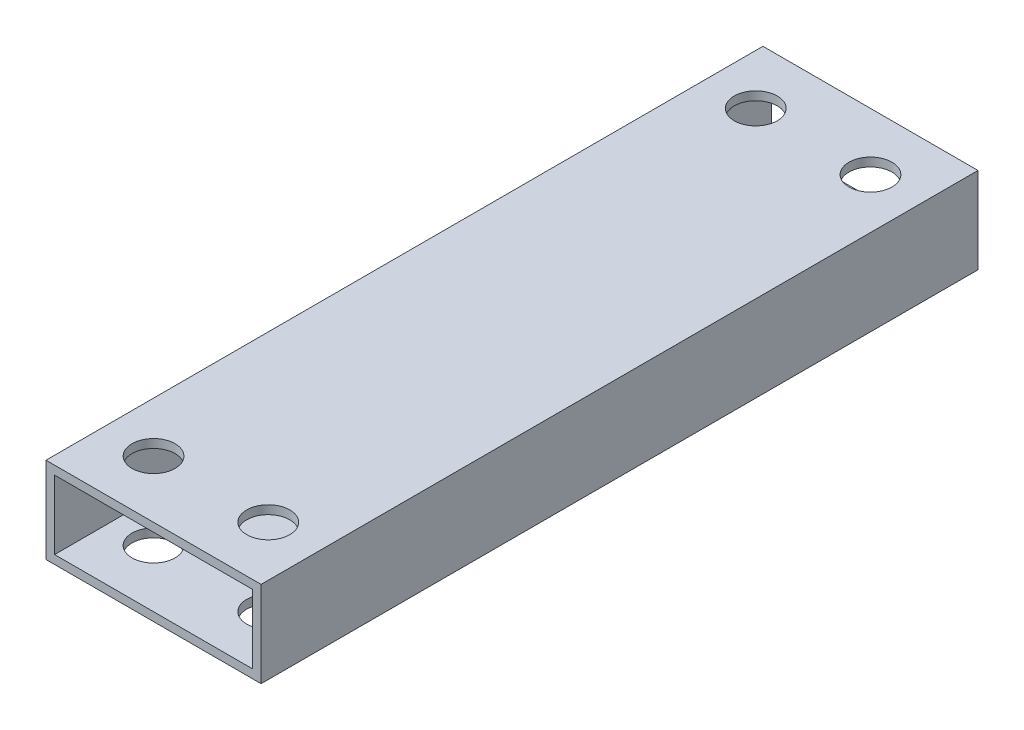
ISO-10303-21;
HEADER;
FILE_DESCRIPTION(('STEP AP214'),'2;1');
FILE_NAME('part.step','',(''),(''),'','','');
FILE_SCHEMA(('AUTOMOTIVE_DESIGN { 1 0 10303 214 1 1 1 1 }'));
ENDSEC;
DATA;
#1=APPLICATION_CONTEXT('core data for automotive mechanical design processes');
#2=APPLICATION_PROTOCOL_DEFINITION('international standard','automotive_design',2000,#1);
#3=PRODUCT_CONTEXT('',#1,'mechanical');
#4=PRODUCT('Part','Part','',(#3));
#5=PRODUCT_RELATED_PRODUCT_CATEGORY('part','',(#4));
#6=PRODUCT_DEFINITION_FORMATION('','',#4);
#7=PRODUCT_DEFINITION_CONTEXT('part definition',#1,'design');
#8=PRODUCT_DEFINITION('design','',#6,#7);
#9=PRODUCT_DEFINITION_SHAPE('','',#8);
#10=(LENGTH_UNIT() NAMED_UNIT(*) SI_UNIT(.MILLI.,.METRE.));
#11=(NAMED_UNIT(*) PLANE_ANGLE_UNIT() SI_UNIT($,.RADIAN.));
#12=(NAMED_UNIT(*) SI_UNIT($,.STERADIAN.) SOLID_ANGLE_UNIT());
#13=UNCERTAINTY_MEASURE_WITH_UNIT(LENGTH_MEASURE(1.E-05),#10,'distance_accuracy_value','');
#14=(GEOMETRIC_REPRESENTATION_CONTEXT(3) GLOBAL_UNCERTAINTY_ASSIGNED_CONTEXT((#13)) GLOBAL_UNIT_ASSIGNED_CONTEXT((#10,
#11,#12)) REPRESENTATION_CONTEXT('',''));
#15=CARTESIAN_POINT('',(0.,0.,0.));
#16=DIRECTION('',(0.,0.,1.));
#17=DIRECTION('',(1.,0.,0.));
#18=AXIS2_PLACEMENT_3D('',#15,#16,#17);
#19=CARTESIAN_POINT('',(0.,0.,50.));
#20=DIRECTION('',(0.,0.,1.));
#21=DIRECTION('',(1.,0.,0.));
#22=AXIS2_PLACEMENT_3D('',#19,#20,#21);
#23=PLANE('',#22);
#24=DIRECTION('',(0.,-1.,0.));
#25=VECTOR('',#24,1.);
#26=CARTESIAN_POINT('',(-7.5,-3.,50.));
#27=LINE('',#26,#25);
#28=CARTESIAN_POINT('',(-7.5,3.,50.));
#29=VERTEX_POINT('',#28);
#30=CARTESIAN_POINT('',(-7.5,-3.,50.));
#31=VERTEX_POINT('',#30);
#32=EDGE_CURVE('E140',#29,#31,#27,.T.);
#33=ORIENTED_EDGE('',*,*,#32,.T.);
#34=DIRECTION('',(1.,0.,0.));
#35=VECTOR('',#34,1.);
#36=CARTESIAN_POINT('',(7.5,-3.,50.));
#37=LINE('',#36,#35);
#38=CARTESIAN_POINT('',(7.5,-3.,50.));
#39=VERTEX_POINT('',#38);
#40=EDGE_CURVE('E143',#31,#39,#37,.T.);
#41=ORIENTED_EDGE('',*,*,#40,.T.);
#42=DIRECTION('',(0.,1.,0.));
#43=VECTOR('',#42,1.);
#44=CARTESIAN_POINT('',(7.5,-3.,50.));
#45=LINE('',#44,#43);
#46=CARTESIAN_POINT('',(7.5,3.,50.));
#47=VERTEX_POINT('',#46);
#48=EDGE_CURVE('E146',#39,#47,#45,.T.);
#49=ORIENTED_EDGE('',*,*,#48,.T.);
#50=DIRECTION('',(-1.,0.,0.));
#51=VECTOR('',#50,1.);
#52=CARTESIAN_POINT('',(7.5,3.,50.));
#53=LINE('',#52,#51);
#54=EDGE_CURVE('E148',#47,#29,#53,.T.);
#55=ORIENTED_EDGE('',*,*,#54,.T.);
#56=EDGE_LOOP('',(#33,#41,#49,#55));
#57=FACE_BOUND('',#56,.T.);
#58=DIRECTION('',(1.,0.,0.));
#59=VECTOR('',#58,1.);
#60=CARTESIAN_POINT('',(6.9,-2.4,50.));
#61=LINE('',#60,#59);
#62=CARTESIAN_POINT('',(-6.9,-2.4,50.));
#63=VERTEX_POINT('',#62);
#64=CARTESIAN_POINT('',(6.9,-2.4,50.));
#65=VERTEX_POINT('',#64);
#66=EDGE_CURVE('E110',#63,#65,#61,.T.);
#67=ORIENTED_EDGE('',*,*,#66,.F.);
#68=DIRECTION('',(0.,-1.,0.));
#69=VECTOR('',#68,1.);
#70=CARTESIAN_POINT('',(-6.9,-2.4,50.));
#71=LINE('',#70,#69);
#72=CARTESIAN_POINT('',(-6.9,2.4,50.));
#73=VERTEX_POINT('',#72);
#74=EDGE_CURVE('E102',#73,#63,#71,.T.);
#75=ORIENTED_EDGE('',*,*,#74,.F.);
#76=DIRECTION('',(-1.,0.,0.));
#77=VECTOR('',#76,1.);
#78=CARTESIAN_POINT('',(6.9,2.4,50.));
#79=LINE('',#78,#77);
#80=CARTESIAN_POINT('',(6.9,2.4,50.));
#81=VERTEX_POINT('',#80);
#82=EDGE_CURVE('E124',#81,#73,#79,.T.);
#83=ORIENTED_EDGE('',*,*,#82,.F.);
#84=DIRECTION('',(0.,1.,0.));
#85=VECTOR('',#84,1.);
#86=CARTESIAN_POINT('',(6.9,-2.4,50.));
#87=LINE('',#86,#85);
#88=EDGE_CURVE('E122',#65,#81,#87,.T.);
#89=ORIENTED_EDGE('',*,*,#88,.F.);
#90=EDGE_LOOP('',(#67,#75,#83,#89));
#91=FACE_BOUND('',#90,.T.);
#92=ADVANCED_FACE('F35',(#57,#91),#23,.T.);
#93=CARTESIAN_POINT('',(0.,0.,0.));
#94=DIRECTION('',(0.,0.,1.));
#95=DIRECTION('',(1.,0.,0.));
#96=AXIS2_PLACEMENT_3D('',#93,#94,#95);
#97=PLANE('',#96);
#98=DIRECTION('',(0.,-1.,0.));
#99=VECTOR('',#98,1.);
#100=CARTESIAN_POINT('',(-7.5,-3.,0.));
#101=LINE('',#100,#99);
#102=CARTESIAN_POINT('',(-7.5,3.,0.));
#103=VERTEX_POINT('',#102);
#104=CARTESIAN_POINT('',(-7.5,-3.,0.));
#105=VERTEX_POINT('',#104);
#106=EDGE_CURVE('E118',#103,#105,#101,.T.);
#107=ORIENTED_EDGE('',*,*,#106,.F.);
#108=DIRECTION('',(-1.,0.,0.));
#109=VECTOR('',#108,1.);
#110=CARTESIAN_POINT('',(7.5,3.,0.));
#111=LINE('',#110,#109);
#112=CARTESIAN_POINT('',(7.5,3.,0.));
#113=VERTEX_POINT('',#112);
#114=EDGE_CURVE('E144',#113,#103,#111,.T.);
#115=ORIENTED_EDGE('',*,*,#114,.F.);
#116=DIRECTION('',(0.,1.,0.));
#117=VECTOR('',#116,1.);
#118=CARTESIAN_POINT('',(7.5,-3.,0.));
#119=LINE('',#118,#117);
#120=CARTESIAN_POINT('',(7.5,-3.,0.));
#121=VERTEX_POINT('',#120);
#122=EDGE_CURVE('E155',#121,#113,#119,.T.);
#123=ORIENTED_EDGE('',*,*,#122,.F.);
#124=DIRECTION('',(1.,0.,0.));
#125=VECTOR('',#124,1.);
#126=CARTESIAN_POINT('',(7.5,-3.,0.));
#127=LINE('',#126,#125);
#128=EDGE_CURVE('E153',#105,#121,#127,.T.);
#129=ORIENTED_EDGE('',*,*,#128,.F.);
#130=EDGE_LOOP('',(#107,#115,#123,#129));
#131=FACE_BOUND('',#130,.T.);
#132=DIRECTION('',(0.,-1.,0.));
#133=VECTOR('',#132,1.);
#134=CARTESIAN_POINT('',(-6.9,-2.4,0.));
#135=LINE('',#134,#133);
#136=CARTESIAN_POINT('',(-6.9,2.4,0.));
#137=VERTEX_POINT('',#136);
#138=CARTESIAN_POINT('',(-6.9,-2.4,0.));
#139=VERTEX_POINT('',#138);
#140=EDGE_CURVE('E60',#137,#139,#135,.T.);
#141=ORIENTED_EDGE('',*,*,#140,.T.);
#142=DIRECTION('',(1.,0.,0.));
#143=VECTOR('',#142,1.);
#144=CARTESIAN_POINT('',(6.9,-2.4,0.));
#145=LINE('',#144,#143);
#146=CARTESIAN_POINT('',(6.9,-2.4,0.));
#147=VERTEX_POINT('',#146);
#148=EDGE_CURVE('E117',#139,#147,#145,.T.);
#149=ORIENTED_EDGE('',*,*,#148,.T.);
#150=DIRECTION('',(0.,1.,0.));
#151=VECTOR('',#150,1.);
#152=CARTESIAN_POINT('',(6.9,-2.4,0.));
#153=LINE('',#152,#151);
#154=CARTESIAN_POINT('',(6.9,2.4,0.));
#155=VERTEX_POINT('',#154);
#156=EDGE_CURVE('E132',#147,#155,#153,.T.);
#157=ORIENTED_EDGE('',*,*,#156,.T.);
#158=DIRECTION('',(-1.,0.,0.));
#159=VECTOR('',#158,1.);
#160=CARTESIAN_POINT('',(6.9,2.4,0.));
#161=LINE('',#160,#159);
#162=EDGE_CURVE('E111',#155,#137,#161,.T.);
#163=ORIENTED_EDGE('',*,*,#162,.T.);
#164=EDGE_LOOP('',(#141,#149,#157,#163));
#165=FACE_BOUND('',#164,.T.);
#166=ADVANCED_FACE('F219',(#131,#165),#97,.F.);
#167=CARTESIAN_POINT('',(-7.5,-3.,50.));
#168=DIRECTION('',(1.,0.,0.));
#169=DIRECTION('',(0.,0.,-1.));
#170=AXIS2_PLACEMENT_3D('',#167,#168,#169);
#171=PLANE('',#170);
#172=ORIENTED_EDGE('',*,*,#106,.T.);
#173=DIRECTION('',(0.,0.,-1.));
#174=VECTOR('',#173,1.);
#175=CARTESIAN_POINT('',(-7.5,-3.,50.));
#176=LINE('',#175,#174);
#177=EDGE_CURVE('E11',#31,#105,#176,.T.);
#178=ORIENTED_EDGE('',*,*,#177,.F.);
#179=ORIENTED_EDGE('',*,*,#32,.F.);
#180=DIRECTION('',(0.,0.,-1.));
#181=VECTOR('',#180,1.);
#182=CARTESIAN_POINT('',(-7.5,3.,50.));
#183=LINE('',#182,#181);
#184=EDGE_CURVE('E150',#29,#103,#183,.T.);
#185=ORIENTED_EDGE('',*,*,#184,.T.);
#186=EDGE_LOOP('',(#172,#178,#179,#185));
#187=FACE_BOUND('',#186,.T.);
#188=ADVANCED_FACE('F37',(#187),#171,.F.);
#189=CARTESIAN_POINT('',(7.5,-3.,50.));
#190=DIRECTION('',(0.,1.,0.));
#191=DIRECTION('',(0.,0.,1.));
#192=AXIS2_PLACEMENT_3D('',#189,#190,#191);
#193=PLANE('',#192);
#194=CARTESIAN_POINT('',(-3.99999999999999,-3.,46.));
#195=DIRECTION('',(0.,1.,0.));
#196=DIRECTION('',(0.,0.,1.));
#197=AXIS2_PLACEMENT_3D('',#194,#195,#196);
#198=CIRCLE('',#197,1.5);
#199=CARTESIAN_POINT('',(-3.99999999999999,-3.,47.5));
#200=VERTEX_POINT('',#199);
#201=EDGE_CURVE('E130',#200,#200,#198,.T.);
#202=ORIENTED_EDGE('',*,*,#201,.T.);
#203=EDGE_LOOP('',(#202));
#204=FACE_BOUND('',#203,.T.);
#205=CARTESIAN_POINT('',(4.00000000000001,-3.,46.));
#206=DIRECTION('',(0.,1.,0.));
#207=DIRECTION('',(0.,0.,1.));
#208=AXIS2_PLACEMENT_3D('',#205,#206,#207);
#209=CIRCLE('',#208,1.5);
#210=CARTESIAN_POINT('',(4.00000000000001,-3.,47.5));
#211=VERTEX_POINT('',#210);
#212=EDGE_CURVE('E181',#211,#211,#209,.T.);
#213=ORIENTED_EDGE('',*,*,#212,.T.);
#214=EDGE_LOOP('',(#213));
#215=FACE_BOUND('',#214,.T.);
#216=CARTESIAN_POINT('',(4.,-3.,4.));
#217=DIRECTION('',(0.,1.,0.));
#218=DIRECTION('',(0.,0.,1.));
#219=AXIS2_PLACEMENT_3D('',#216,#217,#218);
#220=CIRCLE('',#219,1.5);
#221=CARTESIAN_POINT('',(4.,-3.,5.5));
#222=VERTEX_POINT('',#221);
#223=EDGE_CURVE('E177',#222,#222,#220,.T.);
#224=ORIENTED_EDGE('',*,*,#223,.T.);
#225=EDGE_LOOP('',(#224));
#226=FACE_BOUND('',#225,.T.);
#227=CARTESIAN_POINT('',(-4.,-3.,4.));
#228=DIRECTION('',(0.,1.,0.));
#229=DIRECTION('',(0.,0.,1.));
#230=AXIS2_PLACEMENT_3D('',#227,#228,#229);
#231=CIRCLE('',#230,1.5);
#232=CARTESIAN_POINT('',(-4.,-3.,5.5));
#233=VERTEX_POINT('',#232);
#234=EDGE_CURVE('E173',#233,#233,#231,.T.);
#235=ORIENTED_EDGE('',*,*,#234,.T.);
#236=EDGE_LOOP('',(#235));
#237=FACE_BOUND('',#236,.T.);
#238=ORIENTED_EDGE('',*,*,#128,.T.);
#239=DIRECTION('',(0.,0.,-1.));
#240=VECTOR('',#239,1.);
#241=CARTESIAN_POINT('',(7.5,-3.,50.));
#242=LINE('',#241,#240);
#243=EDGE_CURVE('E44',#39,#121,#242,.T.);
#244=ORIENTED_EDGE('',*,*,#243,.F.);
#245=ORIENTED_EDGE('',*,*,#40,.F.);
#246=ORIENTED_EDGE('',*,*,#177,.T.);
#247=EDGE_LOOP('',(#238,#244,#245,#246));
#248=FACE_BOUND('',#247,.T.);
#249=ADVANCED_FACE('F198',(#204,#215,#226,#237,#248),#193,.F.);
#250=CARTESIAN_POINT('',(7.5,-3.,50.));
#251=DIRECTION('',(-1.,0.,0.));
#252=DIRECTION('',(0.,0.,1.));
#253=AXIS2_PLACEMENT_3D('',#250,#251,#252);
#254=PLANE('',#253);
#255=ORIENTED_EDGE('',*,*,#122,.T.);
#256=DIRECTION('',(0.,0.,-1.));
#257=VECTOR('',#256,1.);
#258=CARTESIAN_POINT('',(7.5,3.,50.));
#259=LINE('',#258,#257);
#260=EDGE_CURVE('E160',#47,#113,#259,.T.);
#261=ORIENTED_EDGE('',*,*,#260,.F.);
#262=ORIENTED_EDGE('',*,*,#48,.F.);
#263=ORIENTED_EDGE('',*,*,#243,.T.);
#264=EDGE_LOOP('',(#255,#261,#262,#263));
#265=FACE_BOUND('',#264,.T.);
#266=ADVANCED_FACE('F233',(#265),#254,.F.);
#267=CARTESIAN_POINT('',(7.5,3.,50.));
#268=DIRECTION('',(0.,-1.,0.));
#269=DIRECTION('',(0.,0.,-1.));
#270=AXIS2_PLACEMENT_3D('',#267,#268,#269);
#271=PLANE('',#270);
#272=CARTESIAN_POINT('',(-3.99999999999999,3.,46.));
#273=DIRECTION('',(0.,1.,0.));
#274=DIRECTION('',(0.,0.,-1.));
#275=AXIS2_PLACEMENT_3D('',#272,#273,#274);
#276=CIRCLE('',#275,1.5);
#277=CARTESIAN_POINT('',(-3.99999999999999,3.,44.5));
#278=VERTEX_POINT('',#277);
#279=EDGE_CURVE('E294',#278,#278,#276,.T.);
#280=ORIENTED_EDGE('',*,*,#279,.F.);
#281=EDGE_LOOP('',(#280));
#282=FACE_BOUND('',#281,.T.);
#283=CARTESIAN_POINT('',(4.00000000000001,3.,46.));
#284=DIRECTION('',(0.,1.,0.));
#285=DIRECTION('',(0.,0.,-1.));
#286=AXIS2_PLACEMENT_3D('',#283,#284,#285);
#287=CIRCLE('',#286,1.5);
#288=CARTESIAN_POINT('',(4.00000000000001,3.,44.5));
#289=VERTEX_POINT('',#288);
#290=EDGE_CURVE('E297',#289,#289,#287,.T.);
#291=ORIENTED_EDGE('',*,*,#290,.F.);
#292=EDGE_LOOP('',(#291));
#293=FACE_BOUND('',#292,.T.);
#294=CARTESIAN_POINT('',(4.,3.,4.));
#295=DIRECTION('',(0.,1.,0.));
#296=DIRECTION('',(0.,0.,1.));
#297=AXIS2_PLACEMENT_3D('',#294,#295,#296);
#298=CIRCLE('',#297,1.5);
#299=CARTESIAN_POINT('',(4.,3.,5.5));
#300=VERTEX_POINT('',#299);
#301=EDGE_CURVE('E293',#300,#300,#298,.T.);
#302=ORIENTED_EDGE('',*,*,#301,.F.);
#303=EDGE_LOOP('',(#302));
#304=FACE_BOUND('',#303,.T.);
#305=CARTESIAN_POINT('',(-4.,3.,4.));
#306=DIRECTION('',(0.,1.,0.));
#307=DIRECTION('',(0.,0.,1.));
#308=AXIS2_PLACEMENT_3D('',#305,#306,#307);
#309=CIRCLE('',#308,1.5);
#310=CARTESIAN_POINT('',(-4.,3.,5.5));
#311=VERTEX_POINT('',#310);
#312=EDGE_CURVE('E169',#311,#311,#309,.T.);
#313=ORIENTED_EDGE('',*,*,#312,.F.);
#314=EDGE_LOOP('',(#313));
#315=FACE_BOUND('',#314,.T.);
#316=ORIENTED_EDGE('',*,*,#114,.T.);
#317=ORIENTED_EDGE('',*,*,#184,.F.);
#318=ORIENTED_EDGE('',*,*,#54,.F.);
#319=ORIENTED_EDGE('',*,*,#260,.T.);
#320=EDGE_LOOP('',(#316,#317,#318,#319));
#321=FACE_BOUND('',#320,.T.);
#322=ADVANCED_FACE('F230',(#282,#293,#304,#315,#321),#271,.F.);
#323=CARTESIAN_POINT('',(-6.9,-2.4,50.));
#324=DIRECTION('',(1.,0.,0.));
#325=DIRECTION('',(0.,1.,0.));
#326=AXIS2_PLACEMENT_3D('',#323,#324,#325);
#327=PLANE('',#326);
#328=ORIENTED_EDGE('',*,*,#140,.F.);
#329=DIRECTION('',(0.,0.,-1.));
#330=VECTOR('',#329,1.);
#331=CARTESIAN_POINT('',(-6.9,2.4,50.));
#332=LINE('',#331,#330);
#333=EDGE_CURVE('E106',#73,#137,#332,.T.);
#334=ORIENTED_EDGE('',*,*,#333,.F.);
#335=ORIENTED_EDGE('',*,*,#74,.T.);
#336=DIRECTION('',(0.,0.,-1.));
#337=VECTOR('',#336,1.);
#338=CARTESIAN_POINT('',(-6.9,-2.4,50.));
#339=LINE('',#338,#337);
#340=EDGE_CURVE('E105',#63,#139,#339,.T.);
#341=ORIENTED_EDGE('',*,*,#340,.T.);
#342=EDGE_LOOP('',(#328,#334,#335,#341));
#343=FACE_BOUND('',#342,.T.);
#344=ADVANCED_FACE('F104',(#343),#327,.T.);
#345=CARTESIAN_POINT('',(6.9,-2.4,50.));
#346=DIRECTION('',(0.,1.,0.));
#347=DIRECTION('',(-1.,0.,0.));
#348=AXIS2_PLACEMENT_3D('',#345,#346,#347);
#349=PLANE('',#348);
#350=CARTESIAN_POINT('',(-3.99999999999999,-2.4,46.));
#351=DIRECTION('',(0.,1.,0.));
#352=DIRECTION('',(-1.,0.,0.));
#353=AXIS2_PLACEMENT_3D('',#350,#351,#352);
#354=CIRCLE('',#353,1.5);
#355=CARTESIAN_POINT('',(-5.5,-2.4,46.));
#356=VERTEX_POINT('',#355);
#357=EDGE_CURVE('E193',#356,#356,#354,.T.);
#358=ORIENTED_EDGE('',*,*,#357,.F.);
#359=EDGE_LOOP('',(#358));
#360=FACE_BOUND('',#359,.T.);
#361=CARTESIAN_POINT('',(4.00000000000001,-2.4,46.));
#362=DIRECTION('',(0.,1.,0.));
#363=DIRECTION('',(-1.,0.,0.));
#364=AXIS2_PLACEMENT_3D('',#361,#362,#363);
#365=CIRCLE('',#364,1.5);
#366=CARTESIAN_POINT('',(2.5,-2.4,46.));
#367=VERTEX_POINT('',#366);
#368=EDGE_CURVE('E176',#367,#367,#365,.T.);
#369=ORIENTED_EDGE('',*,*,#368,.F.);
#370=EDGE_LOOP('',(#369));
#371=FACE_BOUND('',#370,.T.);
#372=CARTESIAN_POINT('',(4.,-2.4,4.));
#373=DIRECTION('',(0.,1.,0.));
#374=DIRECTION('',(-1.,0.,0.));
#375=AXIS2_PLACEMENT_3D('',#372,#373,#374);
#376=CIRCLE('',#375,1.5);
#377=CARTESIAN_POINT('',(2.5,-2.4,4.));
#378=VERTEX_POINT('',#377);
#379=EDGE_CURVE('E172',#378,#378,#376,.T.);
#380=ORIENTED_EDGE('',*,*,#379,.F.);
#381=EDGE_LOOP('',(#380));
#382=FACE_BOUND('',#381,.T.);
#383=CARTESIAN_POINT('',(-4.,-2.4,4.));
#384=DIRECTION('',(0.,1.,0.));
#385=DIRECTION('',(-1.,0.,0.));
#386=AXIS2_PLACEMENT_3D('',#383,#384,#385);
#387=CIRCLE('',#386,1.5);
#388=CARTESIAN_POINT('',(-5.5,-2.4,4.));
#389=VERTEX_POINT('',#388);
#390=EDGE_CURVE('E168',#389,#389,#387,.T.);
#391=ORIENTED_EDGE('',*,*,#390,.F.);
#392=EDGE_LOOP('',(#391));
#393=FACE_BOUND('',#392,.T.);
#394=ORIENTED_EDGE('',*,*,#148,.F.);
#395=ORIENTED_EDGE('',*,*,#340,.F.);
#396=ORIENTED_EDGE('',*,*,#66,.T.);
#397=DIRECTION('',(0.,0.,-1.));
#398=VECTOR('',#397,1.);
#399=CARTESIAN_POINT('',(6.9,-2.4,50.));
#400=LINE('',#399,#398);
#401=EDGE_CURVE('E119',#65,#147,#400,.T.);
#402=ORIENTED_EDGE('',*,*,#401,.T.);
#403=EDGE_LOOP('',(#394,#395,#396,#402));
#404=FACE_BOUND('',#403,.T.);
#405=ADVANCED_FACE('F114',(#360,#371,#382,#393,#404),#349,.T.);
#406=CARTESIAN_POINT('',(6.9,-2.4,50.));
#407=DIRECTION('',(-1.,0.,0.));
#408=DIRECTION('',(0.,-1.,0.));
#409=AXIS2_PLACEMENT_3D('',#406,#407,#408);
#410=PLANE('',#409);
#411=ORIENTED_EDGE('',*,*,#156,.F.);
#412=ORIENTED_EDGE('',*,*,#401,.F.);
#413=ORIENTED_EDGE('',*,*,#88,.T.);
#414=DIRECTION('',(0.,0.,-1.));
#415=VECTOR('',#414,1.);
#416=CARTESIAN_POINT('',(6.9,2.4,50.));
#417=LINE('',#416,#415);
#418=EDGE_CURVE('E52',#81,#155,#417,.T.);
#419=ORIENTED_EDGE('',*,*,#418,.T.);
#420=EDGE_LOOP('',(#411,#412,#413,#419));
#421=FACE_BOUND('',#420,.T.);
#422=ADVANCED_FACE('F261',(#421),#410,.T.);
#423=CARTESIAN_POINT('',(6.9,2.4,50.));
#424=DIRECTION('',(0.,-1.,0.));
#425=DIRECTION('',(1.,0.,0.));
#426=AXIS2_PLACEMENT_3D('',#423,#424,#425);
#427=PLANE('',#426);
#428=CARTESIAN_POINT('',(-3.99999999999999,2.4,46.));
#429=DIRECTION('',(0.,-1.,0.));
#430=DIRECTION('',(1.,0.,0.));
#431=AXIS2_PLACEMENT_3D('',#428,#429,#430);
#432=CIRCLE('',#431,1.5);
#433=CARTESIAN_POINT('',(-2.49999999999999,2.4,46.));
#434=VERTEX_POINT('',#433);
#435=EDGE_CURVE('E39',#434,#434,#432,.T.);
#436=ORIENTED_EDGE('',*,*,#435,.F.);
#437=EDGE_LOOP('',(#436));
#438=FACE_BOUND('',#437,.T.);
#439=CARTESIAN_POINT('',(4.00000000000001,2.4,46.));
#440=DIRECTION('',(0.,-1.,0.));
#441=DIRECTION('',(1.,0.,0.));
#442=AXIS2_PLACEMENT_3D('',#439,#440,#441);
#443=CIRCLE('',#442,1.5);
#444=CARTESIAN_POINT('',(5.50000000000001,2.4,46.));
#445=VERTEX_POINT('',#444);
#446=EDGE_CURVE('E174',#445,#445,#443,.T.);
#447=ORIENTED_EDGE('',*,*,#446,.F.);
#448=EDGE_LOOP('',(#447));
#449=FACE_BOUND('',#448,.T.);
#450=CARTESIAN_POINT('',(4.,2.4,4.));
#451=DIRECTION('',(0.,-1.,0.));
#452=DIRECTION('',(1.,0.,0.));
#453=AXIS2_PLACEMENT_3D('',#450,#451,#452);
#454=CIRCLE('',#453,1.5);
#455=CARTESIAN_POINT('',(5.5,2.4,4.));
#456=VERTEX_POINT('',#455);
#457=EDGE_CURVE('E170',#456,#456,#454,.T.);
#458=ORIENTED_EDGE('',*,*,#457,.F.);
#459=EDGE_LOOP('',(#458));
#460=FACE_BOUND('',#459,.T.);
#461=CARTESIAN_POINT('',(-4.,2.4,4.));
#462=DIRECTION('',(0.,-1.,0.));
#463=DIRECTION('',(1.,0.,0.));
#464=AXIS2_PLACEMENT_3D('',#461,#462,#463);
#465=CIRCLE('',#464,1.5);
#466=CARTESIAN_POINT('',(-2.5,2.4,4.));
#467=VERTEX_POINT('',#466);
#468=EDGE_CURVE('E165',#467,#467,#465,.T.);
#469=ORIENTED_EDGE('',*,*,#468,.F.);
#470=EDGE_LOOP('',(#469));
#471=FACE_BOUND('',#470,.T.);
#472=ORIENTED_EDGE('',*,*,#162,.F.);
#473=ORIENTED_EDGE('',*,*,#418,.F.);
#474=ORIENTED_EDGE('',*,*,#82,.T.);
#475=ORIENTED_EDGE('',*,*,#333,.T.);
#476=EDGE_LOOP('',(#472,#473,#474,#475));
#477=FACE_BOUND('',#476,.T.);
#478=ADVANCED_FACE('F258',(#438,#449,#460,#471,#477),#427,.T.);
#479=CARTESIAN_POINT('',(-4.,-77.,4.));
#480=DIRECTION('',(0.,1.,0.));
#481=DIRECTION('',(0.,0.,1.));
#482=AXIS2_PLACEMENT_3D('',#479,#480,#481);
#483=CYLINDRICAL_SURFACE('',#482,1.5);
#484=ORIENTED_EDGE('',*,*,#468,.T.);
#485=EDGE_LOOP('',(#484));
#486=FACE_BOUND('',#485,.T.);
#487=ORIENTED_EDGE('',*,*,#312,.T.);
#488=EDGE_LOOP('',(#487));
#489=FACE_BOUND('',#488,.T.);
#490=ADVANCED_FACE('F260',(#486,#489),#483,.F.);
#491=CARTESIAN_POINT('',(4.,-77.,4.));
#492=DIRECTION('',(0.,1.,0.));
#493=DIRECTION('',(0.,0.,1.));
#494=AXIS2_PLACEMENT_3D('',#491,#492,#493);
#495=CYLINDRICAL_SURFACE('',#494,1.5);
#496=ORIENTED_EDGE('',*,*,#457,.T.);
#497=EDGE_LOOP('',(#496));
#498=FACE_BOUND('',#497,.T.);
#499=ORIENTED_EDGE('',*,*,#301,.T.);
#500=EDGE_LOOP('',(#499));
#501=FACE_BOUND('',#500,.T.);
#502=ADVANCED_FACE('F268',(#498,#501),#495,.F.);
#503=CARTESIAN_POINT('',(4.00000000000001,-77.,46.));
#504=DIRECTION('',(0.,1.,0.));
#505=DIRECTION('',(0.,0.,1.));
#506=AXIS2_PLACEMENT_3D('',#503,#504,#505);
#507=CYLINDRICAL_SURFACE('',#506,1.5);
#508=ORIENTED_EDGE('',*,*,#446,.T.);
#509=EDGE_LOOP('',(#508));
#510=FACE_BOUND('',#509,.T.);
#511=ORIENTED_EDGE('',*,*,#290,.T.);
#512=EDGE_LOOP('',(#511));
#513=FACE_BOUND('',#512,.T.);
#514=ADVANCED_FACE('F213',(#510,#513),#507,.F.);
#515=CARTESIAN_POINT('',(-3.99999999999999,-77.,46.));
#516=DIRECTION('',(0.,1.,0.));
#517=DIRECTION('',(0.,0.,1.));
#518=AXIS2_PLACEMENT_3D('',#515,#516,#517);
#519=CYLINDRICAL_SURFACE('',#518,1.5);
#520=ORIENTED_EDGE('',*,*,#435,.T.);
#521=EDGE_LOOP('',(#520));
#522=FACE_BOUND('',#521,.T.);
#523=ORIENTED_EDGE('',*,*,#279,.T.);
#524=EDGE_LOOP('',(#523));
#525=FACE_BOUND('',#524,.T.);
#526=ADVANCED_FACE('F206',(#522,#525),#519,.F.);
#527=ORIENTED_EDGE('',*,*,#390,.T.);
#528=EDGE_LOOP('',(#527));
#529=FACE_BOUND('',#528,.T.);
#530=ORIENTED_EDGE('',*,*,#234,.F.);
#531=EDGE_LOOP('',(#530));
#532=FACE_BOUND('',#531,.T.);
#533=ADVANCED_FACE('F216',(#529,#532),#483,.F.);
#534=ORIENTED_EDGE('',*,*,#379,.T.);
#535=EDGE_LOOP('',(#534));
#536=FACE_BOUND('',#535,.T.);
#537=ORIENTED_EDGE('',*,*,#223,.F.);
#538=EDGE_LOOP('',(#537));
#539=FACE_BOUND('',#538,.T.);
#540=ADVANCED_FACE('F210',(#536,#539),#495,.F.);
#541=ORIENTED_EDGE('',*,*,#368,.T.);
#542=EDGE_LOOP('',(#541));
#543=FACE_BOUND('',#542,.T.);
#544=ORIENTED_EDGE('',*,*,#212,.F.);
#545=EDGE_LOOP('',(#544));
#546=FACE_BOUND('',#545,.T.);
#547=ADVANCED_FACE('F203',(#543,#546),#507,.F.);
#548=ORIENTED_EDGE('',*,*,#357,.T.);
#549=EDGE_LOOP('',(#548));
#550=FACE_BOUND('',#549,.T.);
#551=ORIENTED_EDGE('',*,*,#201,.F.);
#552=EDGE_LOOP('',(#551));
#553=FACE_BOUND('',#552,.T.);
#554=ADVANCED_FACE('F201',(#550,#553),#519,.F.);
#555=CLOSED_SHELL('',(#92,#166,#188,#249,#266,#322,#344,#405,#422,#478,#490,#502,#514,#526,#533,
#540,#547,#554));
#556=MANIFOLD_SOLID_BREP('B2',#555);
#557=ADVANCED_BREP_SHAPE_REPRESENTATION('',(#18,#556),#14);
#558=SHAPE_DEFINITION_REPRESENTATION(#9,#557);
ENDSEC;
END-ISO-10303-21;
